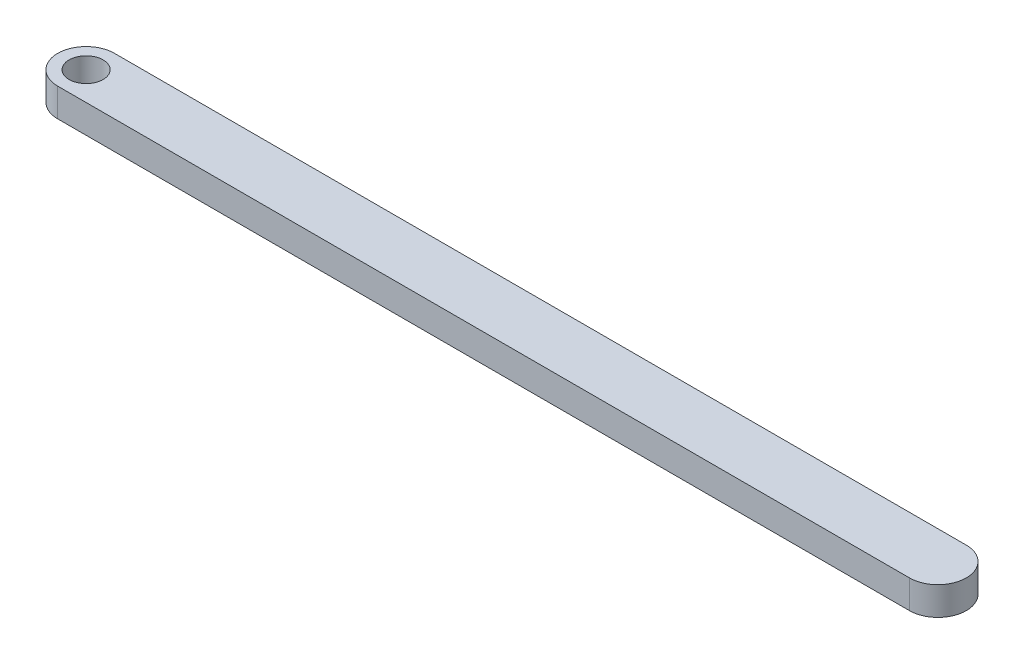
ISO-10303-21;
HEADER;
FILE_DESCRIPTION(('STEP AP214'),'2;1');
FILE_NAME('part.step','',(''),(''),'','','');
FILE_SCHEMA(('AUTOMOTIVE_DESIGN { 1 0 10303 214 1 1 1 1 }'));
ENDSEC;
DATA;
#1=APPLICATION_CONTEXT('core data for automotive mechanical design processes');
#2=APPLICATION_PROTOCOL_DEFINITION('international standard','automotive_design',2000,#1);
#3=PRODUCT_CONTEXT('',#1,'mechanical');
#4=PRODUCT('Part','Part','',(#3));
#5=PRODUCT_RELATED_PRODUCT_CATEGORY('part','',(#4));
#6=PRODUCT_DEFINITION_FORMATION('','',#4);
#7=PRODUCT_DEFINITION_CONTEXT('part definition',#1,'design');
#8=PRODUCT_DEFINITION('design','',#6,#7);
#9=PRODUCT_DEFINITION_SHAPE('','',#8);
#10=(LENGTH_UNIT() NAMED_UNIT(*) SI_UNIT(.MILLI.,.METRE.));
#11=(NAMED_UNIT(*) PLANE_ANGLE_UNIT() SI_UNIT($,.RADIAN.));
#12=(NAMED_UNIT(*) SI_UNIT($,.STERADIAN.) SOLID_ANGLE_UNIT());
#13=UNCERTAINTY_MEASURE_WITH_UNIT(LENGTH_MEASURE(1.E-05),#10,'distance_accuracy_value','');
#14=(GEOMETRIC_REPRESENTATION_CONTEXT(3) GLOBAL_UNCERTAINTY_ASSIGNED_CONTEXT((#13)) GLOBAL_UNIT_ASSIGNED_CONTEXT((#10,
#11,#12)) REPRESENTATION_CONTEXT('',''));
#15=CARTESIAN_POINT('',(0.,0.,0.));
#16=DIRECTION('',(0.,0.,1.));
#17=DIRECTION('',(1.,0.,0.));
#18=AXIS2_PLACEMENT_3D('',#15,#16,#17);
#19=CARTESIAN_POINT('',(0.,5.,5.));
#20=DIRECTION('',(0.,1.,0.));
#21=DIRECTION('',(0.,0.,1.));
#22=AXIS2_PLACEMENT_3D('',#19,#20,#21);
#23=PLANE('',#22);
#24=CARTESIAN_POINT('',(0.,5.,5.));
#25=DIRECTION('',(0.,1.,0.));
#26=DIRECTION('',(0.,0.,1.));
#27=AXIS2_PLACEMENT_3D('',#24,#25,#26);
#28=CIRCLE('',#27,5.);
#29=CARTESIAN_POINT('',(0.,5.,0.));
#30=VERTEX_POINT('',#29);
#31=CARTESIAN_POINT('',(0.,5.,10.));
#32=VERTEX_POINT('',#31);
#33=EDGE_CURVE('E87',#30,#32,#28,.T.);
#34=ORIENTED_EDGE('',*,*,#33,.T.);
#35=DIRECTION('',(1.,0.,0.));
#36=VECTOR('',#35,1.);
#37=CARTESIAN_POINT('',(150.,5.,10.));
#38=LINE('',#37,#36);
#39=CARTESIAN_POINT('',(150.,5.,10.));
#40=VERTEX_POINT('',#39);
#41=EDGE_CURVE('E82',#32,#40,#38,.T.);
#42=ORIENTED_EDGE('',*,*,#41,.T.);
#43=CARTESIAN_POINT('',(150.,5.,5.));
#44=DIRECTION('',(0.,1.,0.));
#45=DIRECTION('',(0.,0.,1.));
#46=AXIS2_PLACEMENT_3D('',#43,#44,#45);
#47=CIRCLE('',#46,5.);
#48=CARTESIAN_POINT('',(150.,5.,0.));
#49=VERTEX_POINT('',#48);
#50=EDGE_CURVE('E85',#40,#49,#47,.T.);
#51=ORIENTED_EDGE('',*,*,#50,.T.);
#52=DIRECTION('',(-1.,0.,0.));
#53=VECTOR('',#52,1.);
#54=CARTESIAN_POINT('',(0.,5.,0.));
#55=LINE('',#54,#53);
#56=EDGE_CURVE('E52',#49,#30,#55,.T.);
#57=ORIENTED_EDGE('',*,*,#56,.T.);
#58=EDGE_LOOP('',(#34,#42,#51,#57));
#59=FACE_BOUND('',#58,.T.);
#60=CARTESIAN_POINT('',(0.,5.,5.));
#61=DIRECTION('',(0.,1.,0.));
#62=DIRECTION('',(0.,0.,1.));
#63=AXIS2_PLACEMENT_3D('',#60,#61,#62);
#64=CIRCLE('',#63,3.);
#65=CARTESIAN_POINT('',(0.,5.,8.));
#66=VERTEX_POINT('',#65);
#67=EDGE_CURVE('E102',#66,#66,#64,.T.);
#68=ORIENTED_EDGE('',*,*,#67,.F.);
#69=EDGE_LOOP('',(#68));
#70=FACE_BOUND('',#69,.T.);
#71=ADVANCED_FACE('F35',(#59,#70),#23,.T.);
#72=CARTESIAN_POINT('',(0.,0.,5.));
#73=DIRECTION('',(0.,1.,0.));
#74=DIRECTION('',(0.,0.,1.));
#75=AXIS2_PLACEMENT_3D('',#72,#73,#74);
#76=PLANE('',#75);
#77=CARTESIAN_POINT('',(0.,0.,5.));
#78=DIRECTION('',(0.,1.,0.));
#79=DIRECTION('',(0.,0.,1.));
#80=AXIS2_PLACEMENT_3D('',#77,#78,#79);
#81=CIRCLE('',#80,5.);
#82=CARTESIAN_POINT('',(0.,0.,0.));
#83=VERTEX_POINT('',#82);
#84=CARTESIAN_POINT('',(0.,0.,10.));
#85=VERTEX_POINT('',#84);
#86=EDGE_CURVE('E99',#83,#85,#81,.T.);
#87=ORIENTED_EDGE('',*,*,#86,.F.);
#88=DIRECTION('',(-1.,0.,0.));
#89=VECTOR('',#88,1.);
#90=CARTESIAN_POINT('',(0.,0.,0.));
#91=LINE('',#90,#89);
#92=CARTESIAN_POINT('',(150.,0.,0.));
#93=VERTEX_POINT('',#92);
#94=EDGE_CURVE('E75',#93,#83,#91,.T.);
#95=ORIENTED_EDGE('',*,*,#94,.F.);
#96=CARTESIAN_POINT('',(150.,0.,5.));
#97=DIRECTION('',(0.,1.,0.));
#98=DIRECTION('',(0.,0.,1.));
#99=AXIS2_PLACEMENT_3D('',#96,#97,#98);
#100=CIRCLE('',#99,5.);
#101=CARTESIAN_POINT('',(150.,0.,10.));
#102=VERTEX_POINT('',#101);
#103=EDGE_CURVE('E69',#102,#93,#100,.T.);
#104=ORIENTED_EDGE('',*,*,#103,.F.);
#105=DIRECTION('',(1.,0.,0.));
#106=VECTOR('',#105,1.);
#107=CARTESIAN_POINT('',(150.,0.,10.));
#108=LINE('',#107,#106);
#109=EDGE_CURVE('E91',#85,#102,#108,.T.);
#110=ORIENTED_EDGE('',*,*,#109,.F.);
#111=EDGE_LOOP('',(#87,#95,#104,#110));
#112=FACE_BOUND('',#111,.T.);
#113=CARTESIAN_POINT('',(0.,0.,5.));
#114=DIRECTION('',(0.,1.,0.));
#115=DIRECTION('',(0.,0.,1.));
#116=AXIS2_PLACEMENT_3D('',#113,#114,#115);
#117=CIRCLE('',#116,3.);
#118=CARTESIAN_POINT('',(0.,0.,8.));
#119=VERTEX_POINT('',#118);
#120=EDGE_CURVE('E114',#119,#119,#117,.T.);
#121=ORIENTED_EDGE('',*,*,#120,.T.);
#122=EDGE_LOOP('',(#121));
#123=FACE_BOUND('',#122,.T.);
#124=ADVANCED_FACE('F110',(#112,#123),#76,.F.);
#125=CARTESIAN_POINT('',(0.,5.,5.));
#126=DIRECTION('',(0.,-1.,0.));
#127=DIRECTION('',(0.,0.,-1.));
#128=AXIS2_PLACEMENT_3D('',#125,#126,#127);
#129=CYLINDRICAL_SURFACE('',#128,5.);
#130=ORIENTED_EDGE('',*,*,#86,.T.);
#131=DIRECTION('',(0.,-1.,0.));
#132=VECTOR('',#131,1.);
#133=CARTESIAN_POINT('',(0.,5.,10.));
#134=LINE('',#133,#132);
#135=EDGE_CURVE('E11',#32,#85,#134,.T.);
#136=ORIENTED_EDGE('',*,*,#135,.F.);
#137=ORIENTED_EDGE('',*,*,#33,.F.);
#138=DIRECTION('',(0.,-1.,0.));
#139=VECTOR('',#138,1.);
#140=CARTESIAN_POINT('',(0.,5.,0.));
#141=LINE('',#140,#139);
#142=EDGE_CURVE('E95',#30,#83,#141,.T.);
#143=ORIENTED_EDGE('',*,*,#142,.T.);
#144=EDGE_LOOP('',(#130,#136,#137,#143));
#145=FACE_BOUND('',#144,.T.);
#146=ADVANCED_FACE('F37',(#145),#129,.T.);
#147=CARTESIAN_POINT('',(150.,5.,10.));
#148=DIRECTION('',(0.,0.,-1.));
#149=DIRECTION('',(-1.,0.,0.));
#150=AXIS2_PLACEMENT_3D('',#147,#148,#149);
#151=PLANE('',#150);
#152=ORIENTED_EDGE('',*,*,#109,.T.);
#153=DIRECTION('',(0.,-1.,0.));
#154=VECTOR('',#153,1.);
#155=CARTESIAN_POINT('',(150.,5.,10.));
#156=LINE('',#155,#154);
#157=EDGE_CURVE('E44',#40,#102,#156,.T.);
#158=ORIENTED_EDGE('',*,*,#157,.F.);
#159=ORIENTED_EDGE('',*,*,#41,.F.);
#160=ORIENTED_EDGE('',*,*,#135,.T.);
#161=EDGE_LOOP('',(#152,#158,#159,#160));
#162=FACE_BOUND('',#161,.T.);
#163=ADVANCED_FACE('F90',(#162),#151,.F.);
#164=CARTESIAN_POINT('',(150.,5.,5.));
#165=DIRECTION('',(0.,-1.,0.));
#166=DIRECTION('',(0.,0.,-1.));
#167=AXIS2_PLACEMENT_3D('',#164,#165,#166);
#168=CYLINDRICAL_SURFACE('',#167,5.);
#169=ORIENTED_EDGE('',*,*,#103,.T.);
#170=DIRECTION('',(0.,-1.,0.));
#171=VECTOR('',#170,1.);
#172=CARTESIAN_POINT('',(150.,5.,0.));
#173=LINE('',#172,#171);
#174=EDGE_CURVE('E92',#49,#93,#173,.T.);
#175=ORIENTED_EDGE('',*,*,#174,.F.);
#176=ORIENTED_EDGE('',*,*,#50,.F.);
#177=ORIENTED_EDGE('',*,*,#157,.T.);
#178=EDGE_LOOP('',(#169,#175,#176,#177));
#179=FACE_BOUND('',#178,.T.);
#180=ADVANCED_FACE('F93',(#179),#168,.T.);
#181=CARTESIAN_POINT('',(0.,5.,0.));
#182=DIRECTION('',(0.,0.,1.));
#183=DIRECTION('',(1.,0.,0.));
#184=AXIS2_PLACEMENT_3D('',#181,#182,#183);
#185=PLANE('',#184);
#186=ORIENTED_EDGE('',*,*,#94,.T.);
#187=ORIENTED_EDGE('',*,*,#142,.F.);
#188=ORIENTED_EDGE('',*,*,#56,.F.);
#189=ORIENTED_EDGE('',*,*,#174,.T.);
#190=EDGE_LOOP('',(#186,#187,#188,#189));
#191=FACE_BOUND('',#190,.T.);
#192=ADVANCED_FACE('F107',(#191),#185,.F.);
#193=CARTESIAN_POINT('',(0.,5.,5.));
#194=DIRECTION('',(0.,-1.,0.));
#195=DIRECTION('',(0.,0.,-1.));
#196=AXIS2_PLACEMENT_3D('',#193,#194,#195);
#197=CYLINDRICAL_SURFACE('',#196,3.);
#198=ORIENTED_EDGE('',*,*,#67,.T.);
#199=EDGE_LOOP('',(#198));
#200=FACE_BOUND('',#199,.T.);
#201=ORIENTED_EDGE('',*,*,#120,.F.);
#202=EDGE_LOOP('',(#201));
#203=FACE_BOUND('',#202,.T.);
#204=ADVANCED_FACE('F120',(#200,#203),#197,.F.);
#205=CLOSED_SHELL('',(#71,#124,#146,#163,#180,#192,#204));
#206=MANIFOLD_SOLID_BREP('B2',#205);
#207=ADVANCED_BREP_SHAPE_REPRESENTATION('',(#18,#206),#14);
#208=SHAPE_DEFINITION_REPRESENTATION(#9,#207);
ENDSEC;
END-ISO-10303-21;
